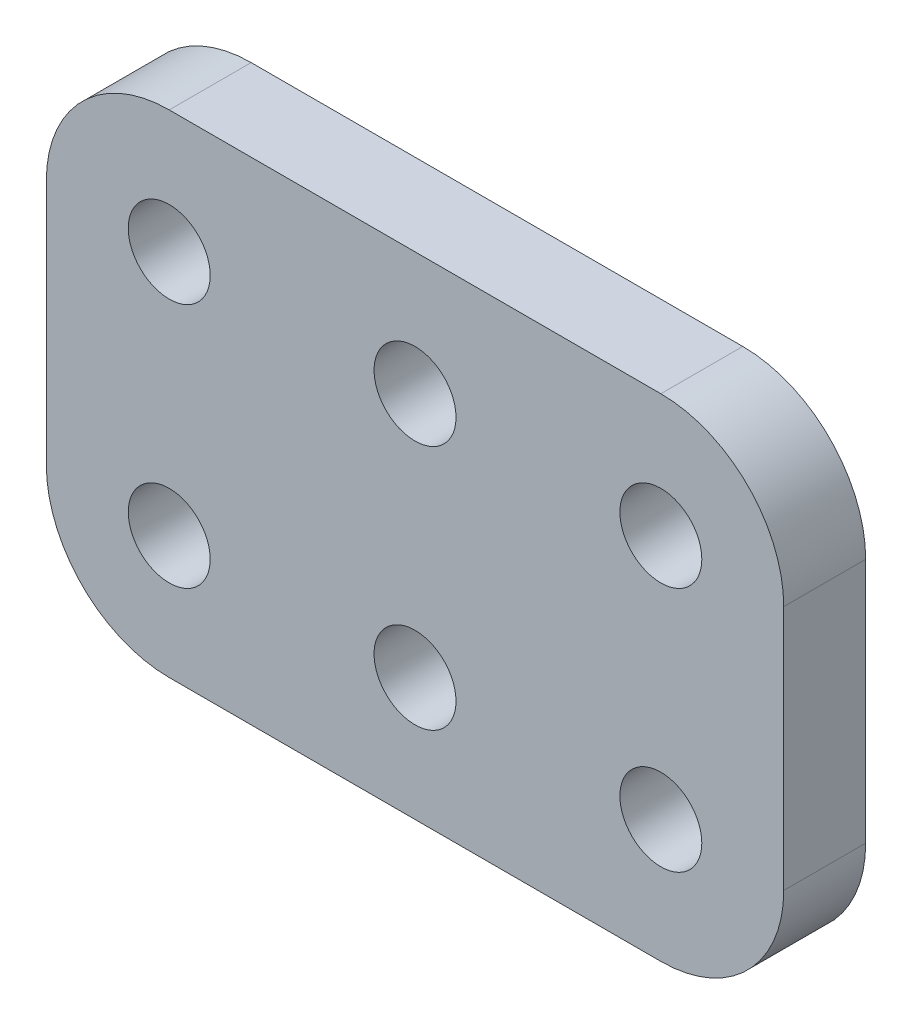
ISO-10303-21;
HEADER;
FILE_DESCRIPTION(('STEP AP214'),'2;1');
FILE_NAME('part.step','',(''),(''),'','','');
FILE_SCHEMA(('AUTOMOTIVE_DESIGN { 1 0 10303 214 1 1 1 1 }'));
ENDSEC;
DATA;
#1=APPLICATION_CONTEXT('core data for automotive mechanical design processes');
#2=APPLICATION_PROTOCOL_DEFINITION('international standard','automotive_design',2000,#1);
#3=PRODUCT_CONTEXT('',#1,'mechanical');
#4=PRODUCT('Part','Part','',(#3));
#5=PRODUCT_RELATED_PRODUCT_CATEGORY('part','',(#4));
#6=PRODUCT_DEFINITION_FORMATION('','',#4);
#7=PRODUCT_DEFINITION_CONTEXT('part definition',#1,'design');
#8=PRODUCT_DEFINITION('design','',#6,#7);
#9=PRODUCT_DEFINITION_SHAPE('','',#8);
#10=(LENGTH_UNIT() NAMED_UNIT(*) SI_UNIT(.MILLI.,.METRE.));
#11=(NAMED_UNIT(*) PLANE_ANGLE_UNIT() SI_UNIT($,.RADIAN.));
#12=(NAMED_UNIT(*) SI_UNIT($,.STERADIAN.) SOLID_ANGLE_UNIT());
#13=UNCERTAINTY_MEASURE_WITH_UNIT(LENGTH_MEASURE(1.E-05),#10,'distance_accuracy_value','');
#14=(GEOMETRIC_REPRESENTATION_CONTEXT(3) GLOBAL_UNCERTAINTY_ASSIGNED_CONTEXT((#13)) GLOBAL_UNIT_ASSIGNED_CONTEXT((#10,
#11,#12)) REPRESENTATION_CONTEXT('',''));
#15=CARTESIAN_POINT('',(0.,0.,0.));
#16=DIRECTION('',(0.,0.,1.));
#17=DIRECTION('',(1.,0.,0.));
#18=AXIS2_PLACEMENT_3D('',#15,#16,#17);
#19=CARTESIAN_POINT('',(213.3359221937,165.8331963046,3.));
#20=DIRECTION('',(0.,0.,1.));
#21=DIRECTION('',(1.,0.,0.));
#22=AXIS2_PLACEMENT_3D('',#19,#20,#21);
#23=PLANE('',#22);
#24=CARTESIAN_POINT('',(213.3359221937,174.8331963046,3.));
#25=DIRECTION('',(0.,0.,1.));
#26=DIRECTION('',(1.,0.,0.));
#27=AXIS2_PLACEMENT_3D('',#24,#25,#26);
#28=CIRCLE('',#27,1.5);
#29=CARTESIAN_POINT('',(214.8359221937,174.8331963046,3.));
#30=VERTEX_POINT('',#29);
#31=EDGE_CURVE('E200',#30,#30,#28,.T.);
#32=ORIENTED_EDGE('',*,*,#31,.F.);
#33=EDGE_LOOP('',(#32));
#34=FACE_BOUND('',#33,.T.);
#35=CARTESIAN_POINT('',(204.3359221937,174.8331963046,3.));
#36=DIRECTION('',(0.,0.,1.));
#37=DIRECTION('',(1.,0.,0.));
#38=AXIS2_PLACEMENT_3D('',#35,#36,#37);
#39=CIRCLE('',#38,1.5);
#40=CARTESIAN_POINT('',(205.8359221937,174.8331963046,3.));
#41=VERTEX_POINT('',#40);
#42=EDGE_CURVE('E188',#41,#41,#39,.T.);
#43=ORIENTED_EDGE('',*,*,#42,.F.);
#44=EDGE_LOOP('',(#43));
#45=FACE_BOUND('',#44,.T.);
#46=CARTESIAN_POINT('',(195.3359221937,174.8331963046,3.));
#47=DIRECTION('',(0.,0.,1.));
#48=DIRECTION('',(1.,0.,0.));
#49=AXIS2_PLACEMENT_3D('',#46,#47,#48);
#50=CIRCLE('',#49,1.5);
#51=CARTESIAN_POINT('',(196.8359221937,174.8331963046,3.));
#52=VERTEX_POINT('',#51);
#53=EDGE_CURVE('E134',#52,#52,#50,.T.);
#54=ORIENTED_EDGE('',*,*,#53,.F.);
#55=EDGE_LOOP('',(#54));
#56=FACE_BOUND('',#55,.T.);
#57=CARTESIAN_POINT('',(213.3359221937,165.8331963046,3.));
#58=DIRECTION('',(0.,0.,1.));
#59=DIRECTION('',(1.,0.,0.));
#60=AXIS2_PLACEMENT_3D('',#57,#58,#59);
#61=CIRCLE('',#60,4.5);
#62=CARTESIAN_POINT('',(213.3359221937,161.3331963046,3.));
#63=VERTEX_POINT('',#62);
#64=CARTESIAN_POINT('',(217.8359221937,165.8331963046,3.));
#65=VERTEX_POINT('',#64);
#66=EDGE_CURVE('E145',#63,#65,#61,.T.);
#67=ORIENTED_EDGE('',*,*,#66,.T.);
#68=DIRECTION('',(0.,1.,0.));
#69=VECTOR('',#68,1.);
#70=CARTESIAN_POINT('',(217.8359221937,165.8331963046,3.));
#71=LINE('',#70,#69);
#72=CARTESIAN_POINT('',(217.8359221937,174.8331963046,3.));
#73=VERTEX_POINT('',#72);
#74=EDGE_CURVE('E93',#65,#73,#71,.T.);
#75=ORIENTED_EDGE('',*,*,#74,.T.);
#76=CARTESIAN_POINT('',(213.3359221937,174.8331963046,3.));
#77=DIRECTION('',(0.,0.,1.));
#78=DIRECTION('',(1.,0.,0.));
#79=AXIS2_PLACEMENT_3D('',#76,#77,#78);
#80=CIRCLE('',#79,4.49999999999999);
#81=CARTESIAN_POINT('',(213.3359221937,179.3331963046,3.));
#82=VERTEX_POINT('',#81);
#83=EDGE_CURVE('E160',#73,#82,#80,.T.);
#84=ORIENTED_EDGE('',*,*,#83,.T.);
#85=DIRECTION('',(-1.,0.,0.));
#86=VECTOR('',#85,1.);
#87=CARTESIAN_POINT('',(213.3359221937,179.3331963046,3.));
#88=LINE('',#87,#86);
#89=CARTESIAN_POINT('',(195.3359221937,179.3331963046,3.));
#90=VERTEX_POINT('',#89);
#91=EDGE_CURVE('E173',#82,#90,#88,.T.);
#92=ORIENTED_EDGE('',*,*,#91,.T.);
#93=CARTESIAN_POINT('',(195.3359221937,174.8331963046,3.));
#94=DIRECTION('',(0.,0.,1.));
#95=DIRECTION('',(1.,0.,0.));
#96=AXIS2_PLACEMENT_3D('',#93,#94,#95);
#97=CIRCLE('',#96,4.49999999999999);
#98=CARTESIAN_POINT('',(190.8359221937,174.8331963046,3.));
#99=VERTEX_POINT('',#98);
#100=EDGE_CURVE('E112',#90,#99,#97,.T.);
#101=ORIENTED_EDGE('',*,*,#100,.T.);
#102=DIRECTION('',(0.,-1.,0.));
#103=VECTOR('',#102,1.);
#104=CARTESIAN_POINT('',(190.8359221937,174.8331963046,3.));
#105=LINE('',#104,#103);
#106=CARTESIAN_POINT('',(190.8359221937,165.8331963046,3.));
#107=VERTEX_POINT('',#106);
#108=EDGE_CURVE('E106',#99,#107,#105,.T.);
#109=ORIENTED_EDGE('',*,*,#108,.T.);
#110=CARTESIAN_POINT('',(195.3359221937,165.8331963046,3.));
#111=DIRECTION('',(0.,0.,1.));
#112=DIRECTION('',(1.,0.,0.));
#113=AXIS2_PLACEMENT_3D('',#110,#111,#112);
#114=CIRCLE('',#113,4.5);
#115=CARTESIAN_POINT('',(195.3359221937,161.3331963046,3.));
#116=VERTEX_POINT('',#115);
#117=EDGE_CURVE('E110',#107,#116,#114,.T.);
#118=ORIENTED_EDGE('',*,*,#117,.T.);
#119=DIRECTION('',(1.,0.,0.));
#120=VECTOR('',#119,1.);
#121=CARTESIAN_POINT('',(195.3359221937,161.3331963046,3.));
#122=LINE('',#121,#120);
#123=EDGE_CURVE('E50',#116,#63,#122,.T.);
#124=ORIENTED_EDGE('',*,*,#123,.T.);
#125=EDGE_LOOP('',(#67,#75,#84,#92,#101,#109,#118,#124));
#126=FACE_BOUND('',#125,.T.);
#127=CARTESIAN_POINT('',(195.3359221937,165.8331963046,3.));
#128=DIRECTION('',(0.,0.,1.));
#129=DIRECTION('',(1.,0.,0.));
#130=AXIS2_PLACEMENT_3D('',#127,#128,#129);
#131=CIRCLE('',#130,1.5);
#132=CARTESIAN_POINT('',(196.8359221937,165.8331963046,3.));
#133=VERTEX_POINT('',#132);
#134=EDGE_CURVE('E182',#133,#133,#131,.T.);
#135=ORIENTED_EDGE('',*,*,#134,.F.);
#136=EDGE_LOOP('',(#135));
#137=FACE_BOUND('',#136,.T.);
#138=CARTESIAN_POINT('',(204.3359221937,165.8331963046,3.));
#139=DIRECTION('',(0.,0.,1.));
#140=DIRECTION('',(1.,0.,0.));
#141=AXIS2_PLACEMENT_3D('',#138,#139,#140);
#142=CIRCLE('',#141,1.5);
#143=CARTESIAN_POINT('',(205.8359221937,165.8331963046,3.));
#144=VERTEX_POINT('',#143);
#145=EDGE_CURVE('E194',#144,#144,#142,.T.);
#146=ORIENTED_EDGE('',*,*,#145,.F.);
#147=EDGE_LOOP('',(#146));
#148=FACE_BOUND('',#147,.T.);
#149=CARTESIAN_POINT('',(213.3359221937,165.8331963046,3.));
#150=DIRECTION('',(0.,0.,1.));
#151=DIRECTION('',(1.,0.,0.));
#152=AXIS2_PLACEMENT_3D('',#149,#150,#151);
#153=CIRCLE('',#152,1.5);
#154=CARTESIAN_POINT('',(214.8359221937,165.8331963046,3.));
#155=VERTEX_POINT('',#154);
#156=EDGE_CURVE('E206',#155,#155,#153,.T.);
#157=ORIENTED_EDGE('',*,*,#156,.F.);
#158=EDGE_LOOP('',(#157));
#159=FACE_BOUND('',#158,.T.);
#160=ADVANCED_FACE('F33',(#34,#45,#56,#126,#137,#148,#159),#23,.T.);
#161=CARTESIAN_POINT('',(213.3359221937,165.8331963046,0.));
#162=DIRECTION('',(0.,0.,1.));
#163=DIRECTION('',(1.,0.,0.));
#164=AXIS2_PLACEMENT_3D('',#161,#162,#163);
#165=PLANE('',#164);
#166=CARTESIAN_POINT('',(213.3359221937,174.8331963046,0.));
#167=DIRECTION('',(0.,0.,1.));
#168=DIRECTION('',(1.,0.,0.));
#169=AXIS2_PLACEMENT_3D('',#166,#167,#168);
#170=CIRCLE('',#169,1.5);
#171=CARTESIAN_POINT('',(214.8359221937,174.8331963046,0.));
#172=VERTEX_POINT('',#171);
#173=EDGE_CURVE('E203',#172,#172,#170,.T.);
#174=ORIENTED_EDGE('',*,*,#173,.T.);
#175=EDGE_LOOP('',(#174));
#176=FACE_BOUND('',#175,.T.);
#177=CARTESIAN_POINT('',(204.3359221937,174.8331963046,0.));
#178=DIRECTION('',(0.,0.,1.));
#179=DIRECTION('',(1.,0.,0.));
#180=AXIS2_PLACEMENT_3D('',#177,#178,#179);
#181=CIRCLE('',#180,1.5);
#182=CARTESIAN_POINT('',(205.8359221937,174.8331963046,0.));
#183=VERTEX_POINT('',#182);
#184=EDGE_CURVE('E191',#183,#183,#181,.T.);
#185=ORIENTED_EDGE('',*,*,#184,.T.);
#186=EDGE_LOOP('',(#185));
#187=FACE_BOUND('',#186,.T.);
#188=CARTESIAN_POINT('',(195.3359221937,174.8331963046,0.));
#189=DIRECTION('',(0.,0.,1.));
#190=DIRECTION('',(1.,0.,0.));
#191=AXIS2_PLACEMENT_3D('',#188,#189,#190);
#192=CIRCLE('',#191,1.5);
#193=CARTESIAN_POINT('',(196.8359221937,174.8331963046,0.));
#194=VERTEX_POINT('',#193);
#195=EDGE_CURVE('E179',#194,#194,#192,.T.);
#196=ORIENTED_EDGE('',*,*,#195,.T.);
#197=EDGE_LOOP('',(#196));
#198=FACE_BOUND('',#197,.T.);
#199=CARTESIAN_POINT('',(213.3359221937,165.8331963046,0.));
#200=DIRECTION('',(0.,0.,1.));
#201=DIRECTION('',(1.,0.,0.));
#202=AXIS2_PLACEMENT_3D('',#199,#200,#201);
#203=CIRCLE('',#202,4.5);
#204=CARTESIAN_POINT('',(213.3359221937,161.3331963046,0.));
#205=VERTEX_POINT('',#204);
#206=CARTESIAN_POINT('',(217.8359221937,165.8331963046,0.));
#207=VERTEX_POINT('',#206);
#208=EDGE_CURVE('E130',#205,#207,#203,.T.);
#209=ORIENTED_EDGE('',*,*,#208,.F.);
#210=DIRECTION('',(1.,0.,0.));
#211=VECTOR('',#210,1.);
#212=CARTESIAN_POINT('',(195.3359221937,161.3331963046,0.));
#213=LINE('',#212,#211);
#214=CARTESIAN_POINT('',(195.3359221937,161.3331963046,0.));
#215=VERTEX_POINT('',#214);
#216=EDGE_CURVE('E85',#215,#205,#213,.T.);
#217=ORIENTED_EDGE('',*,*,#216,.F.);
#218=CARTESIAN_POINT('',(195.3359221937,165.8331963046,0.));
#219=DIRECTION('',(0.,0.,1.));
#220=DIRECTION('',(1.,0.,0.));
#221=AXIS2_PLACEMENT_3D('',#218,#219,#220);
#222=CIRCLE('',#221,4.5);
#223=CARTESIAN_POINT('',(190.8359221937,165.8331963046,0.));
#224=VERTEX_POINT('',#223);
#225=EDGE_CURVE('E79',#224,#215,#222,.T.);
#226=ORIENTED_EDGE('',*,*,#225,.F.);
#227=DIRECTION('',(0.,-1.,0.));
#228=VECTOR('',#227,1.);
#229=CARTESIAN_POINT('',(190.8359221937,174.8331963046,0.));
#230=LINE('',#229,#228);
#231=CARTESIAN_POINT('',(190.8359221937,174.8331963046,0.));
#232=VERTEX_POINT('',#231);
#233=EDGE_CURVE('E120',#232,#224,#230,.T.);
#234=ORIENTED_EDGE('',*,*,#233,.F.);
#235=CARTESIAN_POINT('',(195.3359221937,174.8331963046,0.));
#236=DIRECTION('',(0.,0.,1.));
#237=DIRECTION('',(1.,0.,0.));
#238=AXIS2_PLACEMENT_3D('',#235,#236,#237);
#239=CIRCLE('',#238,4.49999999999999);
#240=CARTESIAN_POINT('',(195.3359221937,179.3331963046,0.));
#241=VERTEX_POINT('',#240);
#242=EDGE_CURVE('E140',#241,#232,#239,.T.);
#243=ORIENTED_EDGE('',*,*,#242,.F.);
#244=DIRECTION('',(-1.,0.,0.));
#245=VECTOR('',#244,1.);
#246=CARTESIAN_POINT('',(213.3359221937,179.3331963046,0.));
#247=LINE('',#246,#245);
#248=CARTESIAN_POINT('',(213.3359221937,179.3331963046,0.));
#249=VERTEX_POINT('',#248);
#250=EDGE_CURVE('E138',#249,#241,#247,.T.);
#251=ORIENTED_EDGE('',*,*,#250,.F.);
#252=CARTESIAN_POINT('',(213.3359221937,174.8331963046,0.));
#253=DIRECTION('',(0.,0.,1.));
#254=DIRECTION('',(1.,0.,0.));
#255=AXIS2_PLACEMENT_3D('',#252,#253,#254);
#256=CIRCLE('',#255,4.49999999999999);
#257=CARTESIAN_POINT('',(217.8359221937,174.8331963046,0.));
#258=VERTEX_POINT('',#257);
#259=EDGE_CURVE('E136',#258,#249,#256,.T.);
#260=ORIENTED_EDGE('',*,*,#259,.F.);
#261=DIRECTION('',(0.,1.,0.));
#262=VECTOR('',#261,1.);
#263=CARTESIAN_POINT('',(217.8359221937,165.8331963046,0.));
#264=LINE('',#263,#262);
#265=EDGE_CURVE('E133',#207,#258,#264,.T.);
#266=ORIENTED_EDGE('',*,*,#265,.F.);
#267=EDGE_LOOP('',(#209,#217,#226,#234,#243,#251,#260,#266));
#268=FACE_BOUND('',#267,.T.);
#269=CARTESIAN_POINT('',(195.3359221937,165.8331963046,0.));
#270=DIRECTION('',(0.,0.,1.));
#271=DIRECTION('',(1.,0.,0.));
#272=AXIS2_PLACEMENT_3D('',#269,#270,#271);
#273=CIRCLE('',#272,1.5);
#274=CARTESIAN_POINT('',(196.8359221937,165.8331963046,0.));
#275=VERTEX_POINT('',#274);
#276=EDGE_CURVE('E185',#275,#275,#273,.T.);
#277=ORIENTED_EDGE('',*,*,#276,.T.);
#278=EDGE_LOOP('',(#277));
#279=FACE_BOUND('',#278,.T.);
#280=CARTESIAN_POINT('',(204.3359221937,165.8331963046,0.));
#281=DIRECTION('',(0.,0.,1.));
#282=DIRECTION('',(1.,0.,0.));
#283=AXIS2_PLACEMENT_3D('',#280,#281,#282);
#284=CIRCLE('',#283,1.5);
#285=CARTESIAN_POINT('',(205.8359221937,165.8331963046,0.));
#286=VERTEX_POINT('',#285);
#287=EDGE_CURVE('E197',#286,#286,#284,.T.);
#288=ORIENTED_EDGE('',*,*,#287,.T.);
#289=EDGE_LOOP('',(#288));
#290=FACE_BOUND('',#289,.T.);
#291=CARTESIAN_POINT('',(213.3359221937,165.8331963046,0.));
#292=DIRECTION('',(0.,0.,1.));
#293=DIRECTION('',(1.,0.,0.));
#294=AXIS2_PLACEMENT_3D('',#291,#292,#293);
#295=CIRCLE('',#294,1.5);
#296=CARTESIAN_POINT('',(214.8359221937,165.8331963046,0.));
#297=VERTEX_POINT('',#296);
#298=EDGE_CURVE('E209',#297,#297,#295,.T.);
#299=ORIENTED_EDGE('',*,*,#298,.T.);
#300=EDGE_LOOP('',(#299));
#301=FACE_BOUND('',#300,.T.);
#302=ADVANCED_FACE('F164',(#176,#187,#198,#268,#279,#290,#301),#165,.F.);
#303=CARTESIAN_POINT('',(213.3359221937,165.8331963046,3.));
#304=DIRECTION('',(0.,0.,-1.));
#305=DIRECTION('',(-1.,0.,0.));
#306=AXIS2_PLACEMENT_3D('',#303,#304,#305);
#307=CYLINDRICAL_SURFACE('',#306,4.5);
#308=ORIENTED_EDGE('',*,*,#208,.T.);
#309=DIRECTION('',(0.,0.,-1.));
#310=VECTOR('',#309,1.);
#311=CARTESIAN_POINT('',(217.8359221937,165.8331963046,3.));
#312=LINE('',#311,#310);
#313=EDGE_CURVE('E11',#65,#207,#312,.T.);
#314=ORIENTED_EDGE('',*,*,#313,.F.);
#315=ORIENTED_EDGE('',*,*,#66,.F.);
#316=DIRECTION('',(0.,0.,-1.));
#317=VECTOR('',#316,1.);
#318=CARTESIAN_POINT('',(213.3359221937,161.3331963046,3.));
#319=LINE('',#318,#317);
#320=EDGE_CURVE('E126',#63,#205,#319,.T.);
#321=ORIENTED_EDGE('',*,*,#320,.T.);
#322=EDGE_LOOP('',(#308,#314,#315,#321));
#323=FACE_BOUND('',#322,.T.);
#324=ADVANCED_FACE('F35',(#323),#307,.T.);
#325=CARTESIAN_POINT('',(217.8359221937,165.8331963046,3.));
#326=DIRECTION('',(-1.,0.,0.));
#327=DIRECTION('',(0.,0.,1.));
#328=AXIS2_PLACEMENT_3D('',#325,#326,#327);
#329=PLANE('',#328);
#330=ORIENTED_EDGE('',*,*,#265,.T.);
#331=DIRECTION('',(0.,0.,-1.));
#332=VECTOR('',#331,1.);
#333=CARTESIAN_POINT('',(217.8359221937,174.8331963046,3.));
#334=LINE('',#333,#332);
#335=EDGE_CURVE('E42',#73,#258,#334,.T.);
#336=ORIENTED_EDGE('',*,*,#335,.F.);
#337=ORIENTED_EDGE('',*,*,#74,.F.);
#338=ORIENTED_EDGE('',*,*,#313,.T.);
#339=EDGE_LOOP('',(#330,#336,#337,#338));
#340=FACE_BOUND('',#339,.T.);
#341=ADVANCED_FACE('F244',(#340),#329,.F.);
#342=CARTESIAN_POINT('',(213.3359221937,174.8331963046,3.));
#343=DIRECTION('',(0.,0.,-1.));
#344=DIRECTION('',(-1.,0.,0.));
#345=AXIS2_PLACEMENT_3D('',#342,#343,#344);
#346=CYLINDRICAL_SURFACE('',#345,4.49999999999999);
#347=ORIENTED_EDGE('',*,*,#259,.T.);
#348=DIRECTION('',(0.,0.,-1.));
#349=VECTOR('',#348,1.);
#350=CARTESIAN_POINT('',(213.3359221937,179.3331963046,3.));
#351=LINE('',#350,#349);
#352=EDGE_CURVE('E152',#82,#249,#351,.T.);
#353=ORIENTED_EDGE('',*,*,#352,.F.);
#354=ORIENTED_EDGE('',*,*,#83,.F.);
#355=ORIENTED_EDGE('',*,*,#335,.T.);
#356=EDGE_LOOP('',(#347,#353,#354,#355));
#357=FACE_BOUND('',#356,.T.);
#358=ADVANCED_FACE('F158',(#357),#346,.T.);
#359=CARTESIAN_POINT('',(213.3359221937,179.3331963046,3.));
#360=DIRECTION('',(0.,-1.,0.));
#361=DIRECTION('',(0.,0.,-1.));
#362=AXIS2_PLACEMENT_3D('',#359,#360,#361);
#363=PLANE('',#362);
#364=ORIENTED_EDGE('',*,*,#250,.T.);
#365=DIRECTION('',(0.,0.,-1.));
#366=VECTOR('',#365,1.);
#367=CARTESIAN_POINT('',(195.3359221937,179.3331963046,3.));
#368=LINE('',#367,#366);
#369=EDGE_CURVE('E149',#90,#241,#368,.T.);
#370=ORIENTED_EDGE('',*,*,#369,.F.);
#371=ORIENTED_EDGE('',*,*,#91,.F.);
#372=ORIENTED_EDGE('',*,*,#352,.T.);
#373=EDGE_LOOP('',(#364,#370,#371,#372));
#374=FACE_BOUND('',#373,.T.);
#375=ADVANCED_FACE('F169',(#374),#363,.F.);
#376=CARTESIAN_POINT('',(195.3359221937,174.8331963046,3.));
#377=DIRECTION('',(0.,0.,-1.));
#378=DIRECTION('',(-1.,0.,0.));
#379=AXIS2_PLACEMENT_3D('',#376,#377,#378);
#380=CYLINDRICAL_SURFACE('',#379,4.49999999999999);
#381=ORIENTED_EDGE('',*,*,#242,.T.);
#382=DIRECTION('',(0.,0.,-1.));
#383=VECTOR('',#382,1.);
#384=CARTESIAN_POINT('',(190.8359221937,174.8331963046,3.));
#385=LINE('',#384,#383);
#386=EDGE_CURVE('E121',#99,#232,#385,.T.);
#387=ORIENTED_EDGE('',*,*,#386,.F.);
#388=ORIENTED_EDGE('',*,*,#100,.F.);
#389=ORIENTED_EDGE('',*,*,#369,.T.);
#390=EDGE_LOOP('',(#381,#387,#388,#389));
#391=FACE_BOUND('',#390,.T.);
#392=ADVANCED_FACE('F172',(#391),#380,.T.);
#393=CARTESIAN_POINT('',(190.8359221937,174.8331963046,3.));
#394=DIRECTION('',(1.,0.,0.));
#395=DIRECTION('',(0.,0.,-1.));
#396=AXIS2_PLACEMENT_3D('',#393,#394,#395);
#397=PLANE('',#396);
#398=ORIENTED_EDGE('',*,*,#233,.T.);
#399=DIRECTION('',(0.,0.,-1.));
#400=VECTOR('',#399,1.);
#401=CARTESIAN_POINT('',(190.8359221937,165.8331963046,3.));
#402=LINE('',#401,#400);
#403=EDGE_CURVE('E117',#107,#224,#402,.T.);
#404=ORIENTED_EDGE('',*,*,#403,.F.);
#405=ORIENTED_EDGE('',*,*,#108,.F.);
#406=ORIENTED_EDGE('',*,*,#386,.T.);
#407=EDGE_LOOP('',(#398,#404,#405,#406));
#408=FACE_BOUND('',#407,.T.);
#409=ADVANCED_FACE('F118',(#408),#397,.F.);
#410=CARTESIAN_POINT('',(195.3359221937,165.8331963046,3.));
#411=DIRECTION('',(0.,0.,-1.));
#412=DIRECTION('',(-1.,0.,0.));
#413=AXIS2_PLACEMENT_3D('',#410,#411,#412);
#414=CYLINDRICAL_SURFACE('',#413,4.5);
#415=ORIENTED_EDGE('',*,*,#225,.T.);
#416=DIRECTION('',(0.,0.,-1.));
#417=VECTOR('',#416,1.);
#418=CARTESIAN_POINT('',(195.3359221937,161.3331963046,3.));
#419=LINE('',#418,#417);
#420=EDGE_CURVE('E122',#116,#215,#419,.T.);
#421=ORIENTED_EDGE('',*,*,#420,.F.);
#422=ORIENTED_EDGE('',*,*,#117,.F.);
#423=ORIENTED_EDGE('',*,*,#403,.T.);
#424=EDGE_LOOP('',(#415,#421,#422,#423));
#425=FACE_BOUND('',#424,.T.);
#426=ADVANCED_FACE('F124',(#425),#414,.T.);
#427=CARTESIAN_POINT('',(195.3359221937,161.3331963046,3.));
#428=DIRECTION('',(0.,1.,0.));
#429=DIRECTION('',(0.,0.,1.));
#430=AXIS2_PLACEMENT_3D('',#427,#428,#429);
#431=PLANE('',#430);
#432=ORIENTED_EDGE('',*,*,#216,.T.);
#433=ORIENTED_EDGE('',*,*,#320,.F.);
#434=ORIENTED_EDGE('',*,*,#123,.F.);
#435=ORIENTED_EDGE('',*,*,#420,.T.);
#436=EDGE_LOOP('',(#432,#433,#434,#435));
#437=FACE_BOUND('',#436,.T.);
#438=ADVANCED_FACE('F232',(#437),#431,.F.);
#439=CARTESIAN_POINT('',(195.3359221937,174.8331963046,3.));
#440=DIRECTION('',(0.,0.,-1.));
#441=DIRECTION('',(-1.,0.,0.));
#442=AXIS2_PLACEMENT_3D('',#439,#440,#441);
#443=CYLINDRICAL_SURFACE('',#442,1.5);
#444=ORIENTED_EDGE('',*,*,#53,.T.);
#445=EDGE_LOOP('',(#444));
#446=FACE_BOUND('',#445,.T.);
#447=ORIENTED_EDGE('',*,*,#195,.F.);
#448=EDGE_LOOP('',(#447));
#449=FACE_BOUND('',#448,.T.);
#450=ADVANCED_FACE('F229',(#446,#449),#443,.F.);
#451=CARTESIAN_POINT('',(195.3359221937,165.8331963046,3.));
#452=DIRECTION('',(0.,0.,-1.));
#453=DIRECTION('',(-1.,0.,0.));
#454=AXIS2_PLACEMENT_3D('',#451,#452,#453);
#455=CYLINDRICAL_SURFACE('',#454,1.5);
#456=ORIENTED_EDGE('',*,*,#134,.T.);
#457=EDGE_LOOP('',(#456));
#458=FACE_BOUND('',#457,.T.);
#459=ORIENTED_EDGE('',*,*,#276,.F.);
#460=EDGE_LOOP('',(#459));
#461=FACE_BOUND('',#460,.T.);
#462=ADVANCED_FACE('F308',(#458,#461),#455,.F.);
#463=CARTESIAN_POINT('',(204.3359221937,174.8331963046,3.));
#464=DIRECTION('',(0.,0.,-1.));
#465=DIRECTION('',(-1.,0.,0.));
#466=AXIS2_PLACEMENT_3D('',#463,#464,#465);
#467=CYLINDRICAL_SURFACE('',#466,1.5);
#468=ORIENTED_EDGE('',*,*,#42,.T.);
#469=EDGE_LOOP('',(#468));
#470=FACE_BOUND('',#469,.T.);
#471=ORIENTED_EDGE('',*,*,#184,.F.);
#472=EDGE_LOOP('',(#471));
#473=FACE_BOUND('',#472,.T.);
#474=ADVANCED_FACE('F316',(#470,#473),#467,.F.);
#475=CARTESIAN_POINT('',(204.3359221937,165.8331963046,3.));
#476=DIRECTION('',(0.,0.,-1.));
#477=DIRECTION('',(-1.,0.,0.));
#478=AXIS2_PLACEMENT_3D('',#475,#476,#477);
#479=CYLINDRICAL_SURFACE('',#478,1.5);
#480=ORIENTED_EDGE('',*,*,#145,.T.);
#481=EDGE_LOOP('',(#480));
#482=FACE_BOUND('',#481,.T.);
#483=ORIENTED_EDGE('',*,*,#287,.F.);
#484=EDGE_LOOP('',(#483));
#485=FACE_BOUND('',#484,.T.);
#486=ADVANCED_FACE('F324',(#482,#485),#479,.F.);
#487=CARTESIAN_POINT('',(213.3359221937,174.8331963046,3.));
#488=DIRECTION('',(0.,0.,-1.));
#489=DIRECTION('',(-1.,0.,0.));
#490=AXIS2_PLACEMENT_3D('',#487,#488,#489);
#491=CYLINDRICAL_SURFACE('',#490,1.5);
#492=ORIENTED_EDGE('',*,*,#31,.T.);
#493=EDGE_LOOP('',(#492));
#494=FACE_BOUND('',#493,.T.);
#495=ORIENTED_EDGE('',*,*,#173,.F.);
#496=EDGE_LOOP('',(#495));
#497=FACE_BOUND('',#496,.T.);
#498=ADVANCED_FACE('F333',(#494,#497),#491,.F.);
#499=CARTESIAN_POINT('',(213.3359221937,165.8331963046,3.));
#500=DIRECTION('',(0.,0.,-1.));
#501=DIRECTION('',(-1.,0.,0.));
#502=AXIS2_PLACEMENT_3D('',#499,#500,#501);
#503=CYLINDRICAL_SURFACE('',#502,1.5);
#504=ORIENTED_EDGE('',*,*,#156,.T.);
#505=EDGE_LOOP('',(#504));
#506=FACE_BOUND('',#505,.T.);
#507=ORIENTED_EDGE('',*,*,#298,.F.);
#508=EDGE_LOOP('',(#507));
#509=FACE_BOUND('',#508,.T.);
#510=ADVANCED_FACE('F215',(#506,#509),#503,.F.);
#511=CLOSED_SHELL('',(#160,#302,#324,#341,#358,#375,#392,#409,#426,#438,#450,#462,#474,#486,
#498,#510));
#512=MANIFOLD_SOLID_BREP('B2',#511);
#513=ADVANCED_BREP_SHAPE_REPRESENTATION('',(#18,#512),#14);
#514=SHAPE_DEFINITION_REPRESENTATION(#9,#513);
ENDSEC;
END-ISO-10303-21;
